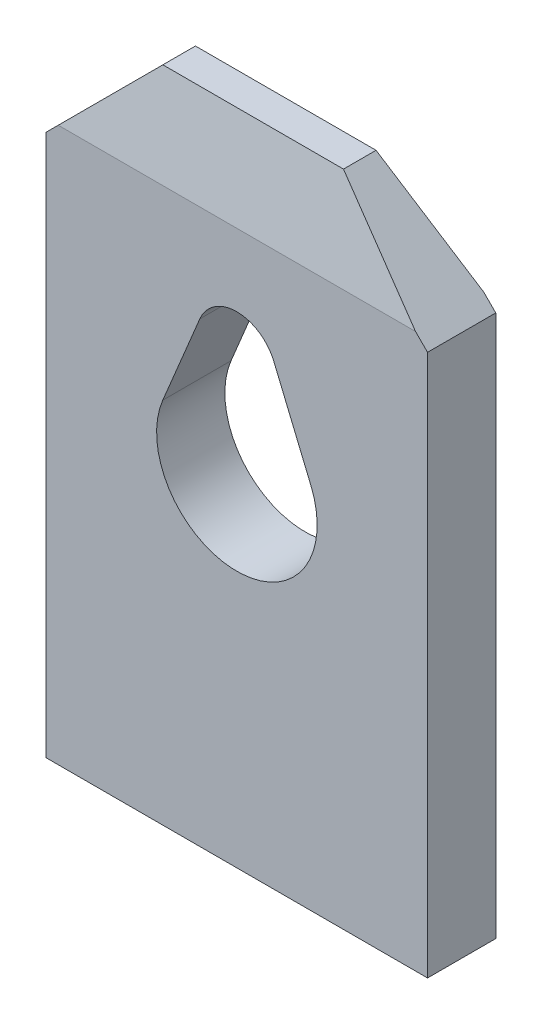
ISO-10303-21;
HEADER;
FILE_DESCRIPTION(('STEP AP214'),'2;1');
FILE_NAME('part.step','',(''),(''),'','','');
FILE_SCHEMA(('AUTOMOTIVE_DESIGN { 1 0 10303 214 1 1 1 1 }'));
ENDSEC;
DATA;
#1=APPLICATION_CONTEXT('core data for automotive mechanical design processes');
#2=APPLICATION_PROTOCOL_DEFINITION('international standard','automotive_design',2000,#1);
#3=PRODUCT_CONTEXT('',#1,'mechanical');
#4=PRODUCT('Part','Part','',(#3));
#5=PRODUCT_RELATED_PRODUCT_CATEGORY('part','',(#4));
#6=PRODUCT_DEFINITION_FORMATION('','',#4);
#7=PRODUCT_DEFINITION_CONTEXT('part definition',#1,'design');
#8=PRODUCT_DEFINITION('design','',#6,#7);
#9=PRODUCT_DEFINITION_SHAPE('','',#8);
#10=(LENGTH_UNIT() NAMED_UNIT(*) SI_UNIT(.MILLI.,.METRE.));
#11=(NAMED_UNIT(*) PLANE_ANGLE_UNIT() SI_UNIT($,.RADIAN.));
#12=(NAMED_UNIT(*) SI_UNIT($,.STERADIAN.) SOLID_ANGLE_UNIT());
#13=UNCERTAINTY_MEASURE_WITH_UNIT(LENGTH_MEASURE(1.E-05),#10,'distance_accuracy_value','');
#14=(GEOMETRIC_REPRESENTATION_CONTEXT(3) GLOBAL_UNCERTAINTY_ASSIGNED_CONTEXT((#13)) GLOBAL_UNIT_ASSIGNED_CONTEXT((#10,
#11,#12)) REPRESENTATION_CONTEXT('',''));
#15=CARTESIAN_POINT('',(0.,0.,0.));
#16=DIRECTION('',(0.,0.,1.));
#17=DIRECTION('',(1.,0.,0.));
#18=AXIS2_PLACEMENT_3D('',#15,#16,#17);
#19=CARTESIAN_POINT('',(4.75,7.05,0.));
#20=DIRECTION('',(0.,-0.214348018272916,0.976757353216485));
#21=DIRECTION('',(0.,-0.976757353216485,-0.214348018272916));
#22=AXIS2_PLACEMENT_3D('',#19,#20,#21);
#23=PLANE('',#22);
#24=DIRECTION('',(-1.,0.,0.));
#25=VECTOR('',#24,1.);
#26=CARTESIAN_POINT('',(4.75,7.05,0.));
#27=LINE('',#26,#25);
#28=CARTESIAN_POINT('',(4.6,7.05,0.));
#29=VERTEX_POINT('',#28);
#30=CARTESIAN_POINT('',(0.15,7.05,0.));
#31=VERTEX_POINT('',#30);
#32=EDGE_CURVE('E202',#29,#31,#27,.T.);
#33=ORIENTED_EDGE('',*,*,#32,.T.);
#34=DIRECTION('',(0.698744344369524,0.698744344369524,0.153338457091523));
#35=VECTOR('',#34,1.);
#36=CARTESIAN_POINT('',(2.39592083042662,9.29592083042662,0.492864146468432));
#37=LINE('',#36,#35);
#38=CARTESIAN_POINT('',(1.25,8.15,0.241393442622949));
#39=VERTEX_POINT('',#38);
#40=EDGE_CURVE('E181',#31,#39,#37,.T.);
#41=ORIENTED_EDGE('',*,*,#40,.T.);
#42=DIRECTION('',(-1.,0.,0.));
#43=VECTOR('',#42,1.);
#44=CARTESIAN_POINT('',(4.75,8.15,0.241393442622949));
#45=LINE('',#44,#43);
#46=CARTESIAN_POINT('',(3.5,8.15,0.241393442622949));
#47=VERTEX_POINT('',#46);
#48=EDGE_CURVE('E11',#47,#39,#45,.T.);
#49=ORIENTED_EDGE('',*,*,#48,.F.);
#50=DIRECTION('',(0.698744344369524,-0.698744344369524,-0.153338457091523));
#51=VECTOR('',#50,1.);
#52=CARTESIAN_POINT('',(4.67323654881826,6.97676345118174,-0.0160716569500576));
#53=LINE('',#52,#51);
#54=EDGE_CURVE('E187',#47,#29,#53,.T.);
#55=ORIENTED_EDGE('',*,*,#54,.T.);
#56=EDGE_LOOP('',(#33,#41,#49,#55));
#57=FACE_BOUND('',#56,.T.);
#58=ADVANCED_FACE('F39',(#57),#23,.F.);
#59=CARTESIAN_POINT('',(4.75,8.15,0.241393442622949));
#60=DIRECTION('',(0.,-1.,0.));
#61=DIRECTION('',(0.,0.,-1.));
#62=AXIS2_PLACEMENT_3D('',#59,#60,#61);
#63=PLANE('',#62);
#64=ORIENTED_EDGE('',*,*,#48,.T.);
#65=DIRECTION('',(0.,0.,1.));
#66=VECTOR('',#65,1.);
#67=CARTESIAN_POINT('',(1.25,8.15,-1.76776695296637));
#68=LINE('',#67,#66);
#69=CARTESIAN_POINT('',(1.25,8.15,0.647131147540979));
#70=VERTEX_POINT('',#69);
#71=EDGE_CURVE('E165',#39,#70,#68,.T.);
#72=ORIENTED_EDGE('',*,*,#71,.T.);
#73=DIRECTION('',(-1.,0.,0.));
#74=VECTOR('',#73,1.);
#75=CARTESIAN_POINT('',(4.75,8.15,0.647131147540979));
#76=LINE('',#75,#74);
#77=CARTESIAN_POINT('',(3.5,8.15,0.647131147540979));
#78=VERTEX_POINT('',#77);
#79=EDGE_CURVE('E46',#78,#70,#76,.T.);
#80=ORIENTED_EDGE('',*,*,#79,.F.);
#81=DIRECTION('',(0.,0.,1.));
#82=VECTOR('',#81,1.);
#83=CARTESIAN_POINT('',(3.5,8.15,-1.76776695296637));
#84=LINE('',#83,#82);
#85=EDGE_CURVE('E173',#47,#78,#84,.T.);
#86=ORIENTED_EDGE('',*,*,#85,.F.);
#87=EDGE_LOOP('',(#64,#72,#80,#86));
#88=FACE_BOUND('',#87,.T.);
#89=ADVANCED_FACE('F227',(#88),#63,.F.);
#90=CARTESIAN_POINT('',(4.75,8.15,0.647131147540979));
#91=DIRECTION('',(0.,-0.181367589437408,-0.983415373838371));
#92=DIRECTION('',(0.,0.983415373838371,-0.181367589437408));
#93=AXIS2_PLACEMENT_3D('',#90,#91,#92);
#94=PLANE('',#93);
#95=ORIENTED_EDGE('',*,*,#79,.T.);
#96=DIRECTION('',(-0.70116968993079,-0.70116968993079,0.12931408215937));
#97=VECTOR('',#96,1.);
#98=CARTESIAN_POINT('',(2.97073626927174,9.87073626927174,0.329782245421185));
#99=LINE('',#98,#97);
#100=CARTESIAN_POINT('',(0.15,7.05,0.849999999999999));
#101=VERTEX_POINT('',#100);
#102=EDGE_CURVE('E171',#70,#101,#99,.T.);
#103=ORIENTED_EDGE('',*,*,#102,.T.);
#104=DIRECTION('',(-1.,0.,0.));
#105=VECTOR('',#104,1.);
#106=CARTESIAN_POINT('',(4.75,7.05,0.85));
#107=LINE('',#106,#105);
#108=CARTESIAN_POINT('',(4.6,7.05,0.849999999999999));
#109=VERTEX_POINT('',#108);
#110=EDGE_CURVE('E218',#109,#101,#107,.T.);
#111=ORIENTED_EDGE('',*,*,#110,.F.);
#112=DIRECTION('',(-0.70116968993079,0.70116968993079,-0.12931408215937));
#113=VECTOR('',#112,1.);
#114=CARTESIAN_POINT('',(4.11454866759705,7.53545133240295,0.760470041155192));
#115=LINE('',#114,#113);
#116=EDGE_CURVE('E184',#109,#78,#115,.T.);
#117=ORIENTED_EDGE('',*,*,#116,.T.);
#118=EDGE_LOOP('',(#95,#103,#111,#117));
#119=FACE_BOUND('',#118,.T.);
#120=ADVANCED_FACE('F223',(#119),#94,.F.);
#121=CARTESIAN_POINT('',(4.75,7.05,0.85));
#122=DIRECTION('',(0.,0.,-1.));
#123=DIRECTION('',(0.,1.,0.));
#124=AXIS2_PLACEMENT_3D('',#121,#122,#123);
#125=PLANE('',#124);
#126=DIRECTION('',(-0.384615384615385,-0.923076923076923,0.));
#127=VECTOR('',#126,1.);
#128=CARTESIAN_POINT('',(1.91346153846154,5.84230769230769,0.849999999999999));
#129=LINE('',#128,#127);
#130=CARTESIAN_POINT('',(1.91346153846154,5.84230769230769,0.85));
#131=VERTEX_POINT('',#130);
#132=CARTESIAN_POINT('',(1.45192307692308,4.73461538461538,0.849999999999999));
#133=VERTEX_POINT('',#132);
#134=EDGE_CURVE('E141',#131,#133,#129,.T.);
#135=ORIENTED_EDGE('',*,*,#134,.F.);
#136=CARTESIAN_POINT('',(2.375,5.65,0.849999999999999));
#137=DIRECTION('',(0.,0.,1.));
#138=DIRECTION('',(1.,0.,0.));
#139=AXIS2_PLACEMENT_3D('',#136,#137,#138);
#140=CIRCLE('',#139,0.5);
#141=CARTESIAN_POINT('',(2.84243697464802,5.82748992853653,0.849999999999999));
#142=VERTEX_POINT('',#141);
#143=EDGE_CURVE('E53',#142,#131,#140,.T.);
#144=ORIENTED_EDGE('',*,*,#143,.F.);
#145=DIRECTION('',(-0.384813689288076,0.922994271128754,0.));
#146=VECTOR('',#145,1.);
#147=CARTESIAN_POINT('',(2.84243697464802,5.82748992853653,0.849999999999999));
#148=LINE('',#147,#146);
#149=CARTESIAN_POINT('',(3.29799427112875,4.73481368928808,0.849999999999999));
#150=VERTEX_POINT('',#149);
#151=EDGE_CURVE('E148',#150,#142,#148,.T.);
#152=ORIENTED_EDGE('',*,*,#151,.F.);
#153=CARTESIAN_POINT('',(2.375,4.35,0.849999999999999));
#154=DIRECTION('',(0.,0.,1.));
#155=DIRECTION('',(1.,0.,0.));
#156=AXIS2_PLACEMENT_3D('',#153,#154,#155);
#157=CIRCLE('',#156,1.);
#158=EDGE_CURVE('E132',#133,#150,#157,.T.);
#159=ORIENTED_EDGE('',*,*,#158,.F.);
#160=EDGE_LOOP('',(#135,#144,#152,#159));
#161=FACE_BOUND('',#160,.T.);
#162=ORIENTED_EDGE('',*,*,#110,.T.);
#163=DIRECTION('',(0.707106781186547,0.707106781186548,0.));
#164=VECTOR('',#163,1.);
#165=CARTESIAN_POINT('',(0.,6.9,0.849999999999999));
#166=LINE('',#165,#164);
#167=CARTESIAN_POINT('',(0.,6.9,0.849999999999999));
#168=VERTEX_POINT('',#167);
#169=EDGE_CURVE('E161',#168,#101,#166,.T.);
#170=ORIENTED_EDGE('',*,*,#169,.F.);
#171=DIRECTION('',(0.,-1.,0.));
#172=VECTOR('',#171,1.);
#173=CARTESIAN_POINT('',(0.,7.05,0.85));
#174=LINE('',#173,#172);
#175=CARTESIAN_POINT('',(0.,0.149999999999999,0.849999999999999));
#176=VERTEX_POINT('',#175);
#177=EDGE_CURVE('E190',#168,#176,#174,.T.);
#178=ORIENTED_EDGE('',*,*,#177,.T.);
#179=DIRECTION('',(-1.,0.,0.));
#180=VECTOR('',#179,1.);
#181=CARTESIAN_POINT('',(4.75,0.149999999999999,0.849999999999999));
#182=LINE('',#181,#180);
#183=CARTESIAN_POINT('',(4.75,0.149999999999999,0.849999999999999));
#184=VERTEX_POINT('',#183);
#185=EDGE_CURVE('E214',#184,#176,#182,.T.);
#186=ORIENTED_EDGE('',*,*,#185,.F.);
#187=DIRECTION('',(0.,-1.,0.));
#188=VECTOR('',#187,1.);
#189=CARTESIAN_POINT('',(4.75,7.05,0.85));
#190=LINE('',#189,#188);
#191=CARTESIAN_POINT('',(4.75,6.9,0.85));
#192=VERTEX_POINT('',#191);
#193=EDGE_CURVE('E191',#192,#184,#190,.T.);
#194=ORIENTED_EDGE('',*,*,#193,.F.);
#195=DIRECTION('',(0.707106781186548,-0.707106781186548,0.));
#196=VECTOR('',#195,1.);
#197=CARTESIAN_POINT('',(3.5,8.15,0.849999999999999));
#198=LINE('',#197,#196);
#199=EDGE_CURVE('E159',#109,#192,#198,.T.);
#200=ORIENTED_EDGE('',*,*,#199,.F.);
#201=EDGE_LOOP('',(#162,#170,#178,#186,#194,#200));
#202=FACE_BOUND('',#201,.T.);
#203=ADVANCED_FACE('F145',(#161,#202),#125,.F.);
#204=CARTESIAN_POINT('',(4.75,0.149999999999999,0.));
#205=DIRECTION('',(0.,1.,0.));
#206=DIRECTION('',(0.,0.,1.));
#207=AXIS2_PLACEMENT_3D('',#204,#205,#206);
#208=PLANE('',#207);
#209=DIRECTION('',(0.,0.,-1.));
#210=VECTOR('',#209,1.);
#211=CARTESIAN_POINT('',(0.,0.149999999999999,0.));
#212=LINE('',#211,#210);
#213=CARTESIAN_POINT('',(0.,0.149999999999999,0.));
#214=VERTEX_POINT('',#213);
#215=EDGE_CURVE('E204',#176,#214,#212,.T.);
#216=ORIENTED_EDGE('',*,*,#215,.T.);
#217=DIRECTION('',(-1.,0.,0.));
#218=VECTOR('',#217,1.);
#219=CARTESIAN_POINT('',(4.75,0.149999999999999,0.));
#220=LINE('',#219,#218);
#221=CARTESIAN_POINT('',(4.75,0.149999999999999,0.));
#222=VERTEX_POINT('',#221);
#223=EDGE_CURVE('E210',#222,#214,#220,.T.);
#224=ORIENTED_EDGE('',*,*,#223,.F.);
#225=DIRECTION('',(0.,0.,-1.));
#226=VECTOR('',#225,1.);
#227=CARTESIAN_POINT('',(4.75,0.149999999999999,0.));
#228=LINE('',#227,#226);
#229=EDGE_CURVE('E194',#184,#222,#228,.T.);
#230=ORIENTED_EDGE('',*,*,#229,.F.);
#231=ORIENTED_EDGE('',*,*,#185,.T.);
#232=EDGE_LOOP('',(#216,#224,#230,#231));
#233=FACE_BOUND('',#232,.T.);
#234=ADVANCED_FACE('F249',(#233),#208,.F.);
#235=CARTESIAN_POINT('',(4.75,0.149999999999999,0.));
#236=DIRECTION('',(0.,0.,1.));
#237=DIRECTION('',(0.,-1.,0.));
#238=AXIS2_PLACEMENT_3D('',#235,#236,#237);
#239=PLANE('',#238);
#240=DIRECTION('',(0.384813689288076,-0.922994271128754,0.));
#241=VECTOR('',#240,1.);
#242=CARTESIAN_POINT('',(2.84243697464802,5.82748992853653,0.));
#243=LINE('',#242,#241);
#244=CARTESIAN_POINT('',(2.84243697464802,5.82748992853653,0.));
#245=VERTEX_POINT('',#244);
#246=CARTESIAN_POINT('',(3.29799427112875,4.73481368928808,0.));
#247=VERTEX_POINT('',#246);
#248=EDGE_CURVE('E351',#245,#247,#243,.T.);
#249=ORIENTED_EDGE('',*,*,#248,.F.);
#250=CARTESIAN_POINT('',(2.375,5.65,0.));
#251=DIRECTION('',(0.,0.,1.));
#252=DIRECTION('',(0.,-1.,0.));
#253=AXIS2_PLACEMENT_3D('',#250,#251,#252);
#254=CIRCLE('',#253,0.5);
#255=CARTESIAN_POINT('',(1.91346153846154,5.84230769230769,0.));
#256=VERTEX_POINT('',#255);
#257=EDGE_CURVE('E160',#256,#245,#254,.F.);
#258=ORIENTED_EDGE('',*,*,#257,.F.);
#259=DIRECTION('',(0.384615384615385,0.923076923076923,0.));
#260=VECTOR('',#259,1.);
#261=CARTESIAN_POINT('',(1.91346153846154,5.84230769230769,0.));
#262=LINE('',#261,#260);
#263=CARTESIAN_POINT('',(1.45192307692308,4.73461538461538,0.));
#264=VERTEX_POINT('',#263);
#265=EDGE_CURVE('E157',#264,#256,#262,.T.);
#266=ORIENTED_EDGE('',*,*,#265,.F.);
#267=CARTESIAN_POINT('',(2.375,4.35,0.));
#268=DIRECTION('',(0.,0.,1.));
#269=DIRECTION('',(0.,-1.,0.));
#270=AXIS2_PLACEMENT_3D('',#267,#268,#269);
#271=CIRCLE('',#270,1.);
#272=EDGE_CURVE('E135',#247,#264,#271,.F.);
#273=ORIENTED_EDGE('',*,*,#272,.F.);
#274=EDGE_LOOP('',(#249,#258,#266,#273));
#275=FACE_BOUND('',#274,.T.);
#276=DIRECTION('',(0.,1.,0.));
#277=VECTOR('',#276,1.);
#278=CARTESIAN_POINT('',(0.,0.149999999999999,0.));
#279=LINE('',#278,#277);
#280=CARTESIAN_POINT('',(0.,6.9,0.));
#281=VERTEX_POINT('',#280);
#282=EDGE_CURVE('E195',#214,#281,#279,.T.);
#283=ORIENTED_EDGE('',*,*,#282,.T.);
#284=DIRECTION('',(-0.707106781186548,-0.707106781186548,0.));
#285=VECTOR('',#284,1.);
#286=CARTESIAN_POINT('',(0.,6.9,0.));
#287=LINE('',#286,#285);
#288=EDGE_CURVE('E168',#31,#281,#287,.T.);
#289=ORIENTED_EDGE('',*,*,#288,.F.);
#290=ORIENTED_EDGE('',*,*,#32,.F.);
#291=DIRECTION('',(-0.707106781186548,0.707106781186548,0.));
#292=VECTOR('',#291,1.);
#293=CARTESIAN_POINT('',(3.5,8.15,0.));
#294=LINE('',#293,#292);
#295=CARTESIAN_POINT('',(4.75,6.9,0.));
#296=VERTEX_POINT('',#295);
#297=EDGE_CURVE('E164',#296,#29,#294,.T.);
#298=ORIENTED_EDGE('',*,*,#297,.F.);
#299=DIRECTION('',(0.,1.,0.));
#300=VECTOR('',#299,1.);
#301=CARTESIAN_POINT('',(4.75,0.149999999999999,0.));
#302=LINE('',#301,#300);
#303=EDGE_CURVE('E198',#222,#296,#302,.T.);
#304=ORIENTED_EDGE('',*,*,#303,.F.);
#305=ORIENTED_EDGE('',*,*,#223,.T.);
#306=EDGE_LOOP('',(#283,#289,#290,#298,#304,#305));
#307=FACE_BOUND('',#306,.T.);
#308=ADVANCED_FACE('F236',(#275,#307),#239,.F.);
#309=CARTESIAN_POINT('',(4.75,0.,0.));
#310=DIRECTION('',(1.,0.,0.));
#311=DIRECTION('',(0.,0.,-1.));
#312=AXIS2_PLACEMENT_3D('',#309,#310,#311);
#313=PLANE('',#312);
#314=DIRECTION('',(0.,0.,1.));
#315=VECTOR('',#314,1.);
#316=CARTESIAN_POINT('',(4.75,6.9,-1.76776695296637));
#317=LINE('',#316,#315);
#318=EDGE_CURVE('E174',#296,#192,#317,.T.);
#319=ORIENTED_EDGE('',*,*,#318,.T.);
#320=ORIENTED_EDGE('',*,*,#193,.T.);
#321=ORIENTED_EDGE('',*,*,#229,.T.);
#322=ORIENTED_EDGE('',*,*,#303,.T.);
#323=EDGE_LOOP('',(#319,#320,#321,#322));
#324=FACE_BOUND('',#323,.T.);
#325=ADVANCED_FACE('F252',(#324),#313,.T.);
#326=CARTESIAN_POINT('',(0.,0.,0.));
#327=DIRECTION('',(1.,0.,0.));
#328=DIRECTION('',(0.,0.,-1.));
#329=AXIS2_PLACEMENT_3D('',#326,#327,#328);
#330=PLANE('',#329);
#331=ORIENTED_EDGE('',*,*,#177,.F.);
#332=DIRECTION('',(0.,0.,1.));
#333=VECTOR('',#332,1.);
#334=CARTESIAN_POINT('',(0.,6.9,-1.76776695296637));
#335=LINE('',#334,#333);
#336=EDGE_CURVE('E163',#281,#168,#335,.T.);
#337=ORIENTED_EDGE('',*,*,#336,.F.);
#338=ORIENTED_EDGE('',*,*,#282,.F.);
#339=ORIENTED_EDGE('',*,*,#215,.F.);
#340=EDGE_LOOP('',(#331,#337,#338,#339));
#341=FACE_BOUND('',#340,.T.);
#342=ADVANCED_FACE('F243',(#341),#330,.F.);
#343=CARTESIAN_POINT('',(0.,6.9,-1.76776695296637));
#344=DIRECTION('',(0.707106781186548,-0.707106781186548,0.));
#345=DIRECTION('',(0.707106781186548,0.707106781186548,0.));
#346=AXIS2_PLACEMENT_3D('',#343,#344,#345);
#347=PLANE('',#346);
#348=ORIENTED_EDGE('',*,*,#288,.T.);
#349=ORIENTED_EDGE('',*,*,#336,.T.);
#350=ORIENTED_EDGE('',*,*,#169,.T.);
#351=ORIENTED_EDGE('',*,*,#102,.F.);
#352=ORIENTED_EDGE('',*,*,#71,.F.);
#353=ORIENTED_EDGE('',*,*,#40,.F.);
#354=EDGE_LOOP('',(#348,#349,#350,#351,#352,#353));
#355=FACE_BOUND('',#354,.T.);
#356=ADVANCED_FACE('F230',(#355),#347,.F.);
#357=CARTESIAN_POINT('',(3.5,8.15,-1.76776695296637));
#358=DIRECTION('',(-0.707106781186547,-0.707106781186547,0.));
#359=DIRECTION('',(0.707106781186548,-0.707106781186548,0.));
#360=AXIS2_PLACEMENT_3D('',#357,#358,#359);
#361=PLANE('',#360);
#362=ORIENTED_EDGE('',*,*,#85,.T.);
#363=ORIENTED_EDGE('',*,*,#116,.F.);
#364=ORIENTED_EDGE('',*,*,#199,.T.);
#365=ORIENTED_EDGE('',*,*,#318,.F.);
#366=ORIENTED_EDGE('',*,*,#297,.T.);
#367=ORIENTED_EDGE('',*,*,#54,.F.);
#368=EDGE_LOOP('',(#362,#363,#364,#365,#366,#367));
#369=FACE_BOUND('',#368,.T.);
#370=ADVANCED_FACE('F255',(#369),#361,.F.);
#371=CARTESIAN_POINT('',(2.375,5.65,-3.44093010681705));
#372=DIRECTION('',(0.,0.,1.));
#373=DIRECTION('',(1.,0.,0.));
#374=AXIS2_PLACEMENT_3D('',#371,#372,#373);
#375=CYLINDRICAL_SURFACE('',#374,0.5);
#376=ORIENTED_EDGE('',*,*,#257,.T.);
#377=DIRECTION('',(0.,0.,1.));
#378=VECTOR('',#377,1.);
#379=CARTESIAN_POINT('',(2.84243697464802,5.82748992853653,-3.44093010681705));
#380=LINE('',#379,#378);
#381=EDGE_CURVE('E153',#245,#142,#380,.T.);
#382=ORIENTED_EDGE('',*,*,#381,.T.);
#383=ORIENTED_EDGE('',*,*,#143,.T.);
#384=DIRECTION('',(0.,0.,1.));
#385=VECTOR('',#384,1.);
#386=CARTESIAN_POINT('',(1.91346153846154,5.84230769230769,-3.44093010681705));
#387=LINE('',#386,#385);
#388=EDGE_CURVE('E138',#256,#131,#387,.T.);
#389=ORIENTED_EDGE('',*,*,#388,.F.);
#390=EDGE_LOOP('',(#376,#382,#383,#389));
#391=FACE_BOUND('',#390,.T.);
#392=ADVANCED_FACE('F257',(#391),#375,.F.);
#393=CARTESIAN_POINT('',(2.84243697464802,5.82748992853653,-3.44093010681705));
#394=DIRECTION('',(0.922994271128754,0.384813689288076,0.));
#395=DIRECTION('',(-0.384813689288076,0.922994271128754,0.));
#396=AXIS2_PLACEMENT_3D('',#393,#394,#395);
#397=PLANE('',#396);
#398=ORIENTED_EDGE('',*,*,#248,.T.);
#399=DIRECTION('',(0.,0.,1.));
#400=VECTOR('',#399,1.);
#401=CARTESIAN_POINT('',(3.29799427112875,4.73481368928808,-3.44093010681705));
#402=LINE('',#401,#400);
#403=EDGE_CURVE('E137',#247,#150,#402,.T.);
#404=ORIENTED_EDGE('',*,*,#403,.T.);
#405=ORIENTED_EDGE('',*,*,#151,.T.);
#406=ORIENTED_EDGE('',*,*,#381,.F.);
#407=EDGE_LOOP('',(#398,#404,#405,#406));
#408=FACE_BOUND('',#407,.T.);
#409=ADVANCED_FACE('F263',(#408),#397,.F.);
#410=CARTESIAN_POINT('',(2.375,4.35,-3.44093010681705));
#411=DIRECTION('',(0.,0.,1.));
#412=DIRECTION('',(1.,0.,0.));
#413=AXIS2_PLACEMENT_3D('',#410,#411,#412);
#414=CYLINDRICAL_SURFACE('',#413,1.);
#415=ORIENTED_EDGE('',*,*,#272,.T.);
#416=DIRECTION('',(0.,0.,1.));
#417=VECTOR('',#416,1.);
#418=CARTESIAN_POINT('',(1.45192307692308,4.73461538461538,-3.44093010681705));
#419=LINE('',#418,#417);
#420=EDGE_CURVE('E61',#264,#133,#419,.T.);
#421=ORIENTED_EDGE('',*,*,#420,.T.);
#422=ORIENTED_EDGE('',*,*,#158,.T.);
#423=ORIENTED_EDGE('',*,*,#403,.F.);
#424=EDGE_LOOP('',(#415,#421,#422,#423));
#425=FACE_BOUND('',#424,.T.);
#426=ADVANCED_FACE('F129',(#425),#414,.F.);
#427=CARTESIAN_POINT('',(1.91346153846154,5.84230769230769,-3.44093010681705));
#428=DIRECTION('',(-0.923076923076923,0.384615384615385,0.));
#429=DIRECTION('',(-0.384615384615385,-0.923076923076923,0.));
#430=AXIS2_PLACEMENT_3D('',#427,#428,#429);
#431=PLANE('',#430);
#432=ORIENTED_EDGE('',*,*,#265,.T.);
#433=ORIENTED_EDGE('',*,*,#388,.T.);
#434=ORIENTED_EDGE('',*,*,#134,.T.);
#435=ORIENTED_EDGE('',*,*,#420,.F.);
#436=EDGE_LOOP('',(#432,#433,#434,#435));
#437=FACE_BOUND('',#436,.T.);
#438=ADVANCED_FACE('F142',(#437),#431,.F.);
#439=CLOSED_SHELL('',(#58,#89,#120,#203,#234,#308,#325,#342,#356,#370,#392,#409,#426,#438));
#440=MANIFOLD_SOLID_BREP('B2',#439);
#441=ADVANCED_BREP_SHAPE_REPRESENTATION('',(#18,#440),#14);
#442=SHAPE_DEFINITION_REPRESENTATION(#9,#441);
ENDSEC;
END-ISO-10303-21;
